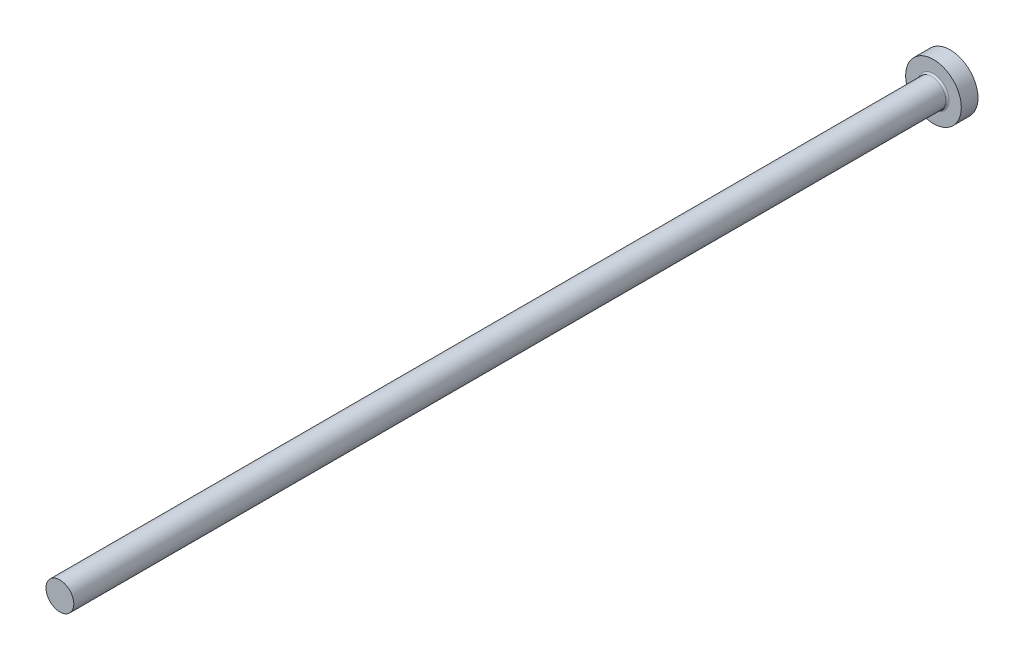
ISO-10303-21;
HEADER;
FILE_DESCRIPTION(('STEP AP214'),'2;1');
FILE_NAME('part.step','',(''),(''),'','','');
FILE_SCHEMA(('AUTOMOTIVE_DESIGN { 1 0 10303 214 1 1 1 1 }'));
ENDSEC;
DATA;
#1=APPLICATION_CONTEXT('core data for automotive mechanical design processes');
#2=APPLICATION_PROTOCOL_DEFINITION('international standard','automotive_design',2000,#1);
#3=PRODUCT_CONTEXT('',#1,'mechanical');
#4=PRODUCT('Part','Part','',(#3));
#5=PRODUCT_RELATED_PRODUCT_CATEGORY('part','',(#4));
#6=PRODUCT_DEFINITION_FORMATION('','',#4);
#7=PRODUCT_DEFINITION_CONTEXT('part definition',#1,'design');
#8=PRODUCT_DEFINITION('design','',#6,#7);
#9=PRODUCT_DEFINITION_SHAPE('','',#8);
#10=(LENGTH_UNIT() NAMED_UNIT(*) SI_UNIT(.MILLI.,.METRE.));
#11=(NAMED_UNIT(*) PLANE_ANGLE_UNIT() SI_UNIT($,.RADIAN.));
#12=(NAMED_UNIT(*) SI_UNIT($,.STERADIAN.) SOLID_ANGLE_UNIT());
#13=UNCERTAINTY_MEASURE_WITH_UNIT(LENGTH_MEASURE(1.E-05),#10,'distance_accuracy_value','');
#14=(GEOMETRIC_REPRESENTATION_CONTEXT(3) GLOBAL_UNCERTAINTY_ASSIGNED_CONTEXT((#13)) GLOBAL_UNIT_ASSIGNED_CONTEXT((#10,
#11,#12)) REPRESENTATION_CONTEXT('',''));
#15=CARTESIAN_POINT('',(0.,0.,0.));
#16=DIRECTION('',(0.,0.,1.));
#17=DIRECTION('',(1.,0.,0.));
#18=AXIS2_PLACEMENT_3D('',#15,#16,#17);
#19=CARTESIAN_POINT('',(0.,0.,3.));
#20=DIRECTION('',(0.,0.,-1.));
#21=DIRECTION('',(-1.,0.,0.));
#22=AXIS2_PLACEMENT_3D('',#19,#20,#21);
#23=PLANE('',#22);
#24=CARTESIAN_POINT('',(0.,0.,3.));
#25=DIRECTION('',(0.,0.,1.));
#26=DIRECTION('',(1.,0.,0.));
#27=AXIS2_PLACEMENT_3D('',#24,#25,#26);
#28=CIRCLE('',#27,5.);
#29=CARTESIAN_POINT('',(5.,0.,3.));
#30=VERTEX_POINT('',#29);
#31=EDGE_CURVE('E42',#30,#30,#28,.T.);
#32=ORIENTED_EDGE('',*,*,#31,.T.);
#33=EDGE_LOOP('',(#32));
#34=FACE_BOUND('',#33,.T.);
#35=CARTESIAN_POINT('',(0.,0.,3.));
#36=DIRECTION('',(0.,0.,1.));
#37=DIRECTION('',(1.,0.,0.));
#38=AXIS2_PLACEMENT_3D('',#35,#36,#37);
#39=CIRCLE('',#38,2.79999999999999);
#40=CARTESIAN_POINT('',(2.79999999999999,0.,3.));
#41=VERTEX_POINT('',#40);
#42=EDGE_CURVE('E10',#41,#41,#39,.T.);
#43=ORIENTED_EDGE('',*,*,#42,.F.);
#44=EDGE_LOOP('',(#43));
#45=FACE_BOUND('',#44,.T.);
#46=ADVANCED_FACE('F32',(#34,#45),#23,.F.);
#47=CARTESIAN_POINT('',(0.,0.,0.));
#48=DIRECTION('',(0.,0.,1.));
#49=DIRECTION('',(1.,0.,0.));
#50=AXIS2_PLACEMENT_3D('',#47,#48,#49);
#51=CYLINDRICAL_SURFACE('',#50,5.);
#52=ORIENTED_EDGE('',*,*,#31,.F.);
#53=EDGE_LOOP('',(#52));
#54=FACE_BOUND('',#53,.T.);
#55=CARTESIAN_POINT('',(0.,0.,0.));
#56=DIRECTION('',(0.,0.,1.));
#57=DIRECTION('',(1.,0.,0.));
#58=AXIS2_PLACEMENT_3D('',#55,#56,#57);
#59=CIRCLE('',#58,5.);
#60=CARTESIAN_POINT('',(5.,0.,0.));
#61=VERTEX_POINT('',#60);
#62=EDGE_CURVE('E46',#61,#61,#59,.T.);
#63=ORIENTED_EDGE('',*,*,#62,.T.);
#64=EDGE_LOOP('',(#63));
#65=FACE_BOUND('',#64,.T.);
#66=ADVANCED_FACE('F68',(#54,#65),#51,.T.);
#67=CARTESIAN_POINT('',(0.,5.,0.));
#68=DIRECTION('',(0.,0.,1.));
#69=DIRECTION('',(1.,0.,0.));
#70=AXIS2_PLACEMENT_3D('',#67,#68,#69);
#71=PLANE('',#70);
#72=ORIENTED_EDGE('',*,*,#62,.F.);
#73=EDGE_LOOP('',(#72));
#74=FACE_BOUND('',#73,.T.);
#75=ADVANCED_FACE('F73',(#74),#71,.F.);
#76=CARTESIAN_POINT('',(0.,0.,3.29999999999999));
#77=DIRECTION('',(0.,0.,1.));
#78=DIRECTION('',(1.,0.,0.));
#79=AXIS2_PLACEMENT_3D('',#76,#77,#78);
#80=TOROIDAL_SURFACE('',#79,2.79999999999999,0.299999999999994);
#81=CARTESIAN_POINT('',(0.,0.,3.29999999999999));
#82=DIRECTION('',(0.,0.,1.));
#83=DIRECTION('',(1.,0.,0.));
#84=AXIS2_PLACEMENT_3D('',#81,#82,#83);
#85=CIRCLE('',#84,2.5);
#86=CARTESIAN_POINT('',(2.5,0.,3.29999999999999));
#87=VERTEX_POINT('',#86);
#88=EDGE_CURVE('E38',#87,#87,#85,.F.);
#89=ORIENTED_EDGE('',*,*,#88,.T.);
#90=EDGE_LOOP('',(#89));
#91=FACE_BOUND('',#90,.T.);
#92=ORIENTED_EDGE('',*,*,#42,.T.);
#93=EDGE_LOOP('',(#92));
#94=FACE_BOUND('',#93,.T.);
#95=ADVANCED_FACE('F64',(#91,#94),#80,.F.);
#96=CARTESIAN_POINT('',(0.,0.,160.));
#97=DIRECTION('',(0.,0.,-1.));
#98=DIRECTION('',(-1.,0.,0.));
#99=AXIS2_PLACEMENT_3D('',#96,#97,#98);
#100=PLANE('',#99);
#101=CARTESIAN_POINT('',(0.,0.,160.));
#102=DIRECTION('',(0.,0.,1.));
#103=DIRECTION('',(1.,0.,0.));
#104=AXIS2_PLACEMENT_3D('',#101,#102,#103);
#105=CIRCLE('',#104,2.5);
#106=CARTESIAN_POINT('',(2.5,0.,160.));
#107=VERTEX_POINT('',#106);
#108=EDGE_CURVE('E51',#107,#107,#105,.T.);
#109=ORIENTED_EDGE('',*,*,#108,.T.);
#110=EDGE_LOOP('',(#109));
#111=FACE_BOUND('',#110,.T.);
#112=ADVANCED_FACE('F55',(#111),#100,.F.);
#113=CARTESIAN_POINT('',(0.,0.,3.));
#114=DIRECTION('',(0.,0.,1.));
#115=DIRECTION('',(1.,0.,0.));
#116=AXIS2_PLACEMENT_3D('',#113,#114,#115);
#117=CYLINDRICAL_SURFACE('',#116,2.5);
#118=ORIENTED_EDGE('',*,*,#108,.F.);
#119=EDGE_LOOP('',(#118));
#120=FACE_BOUND('',#119,.T.);
#121=ORIENTED_EDGE('',*,*,#88,.F.);
#122=EDGE_LOOP('',(#121));
#123=FACE_BOUND('',#122,.T.);
#124=ADVANCED_FACE('F57',(#120,#123),#117,.T.);
#125=CLOSED_SHELL('',(#46,#66,#75,#95,#112,#124));
#126=MANIFOLD_SOLID_BREP('B2',#125);
#127=ADVANCED_BREP_SHAPE_REPRESENTATION('',(#18,#126),#14);
#128=SHAPE_DEFINITION_REPRESENTATION(#9,#127);
ENDSEC;
END-ISO-10303-21;
